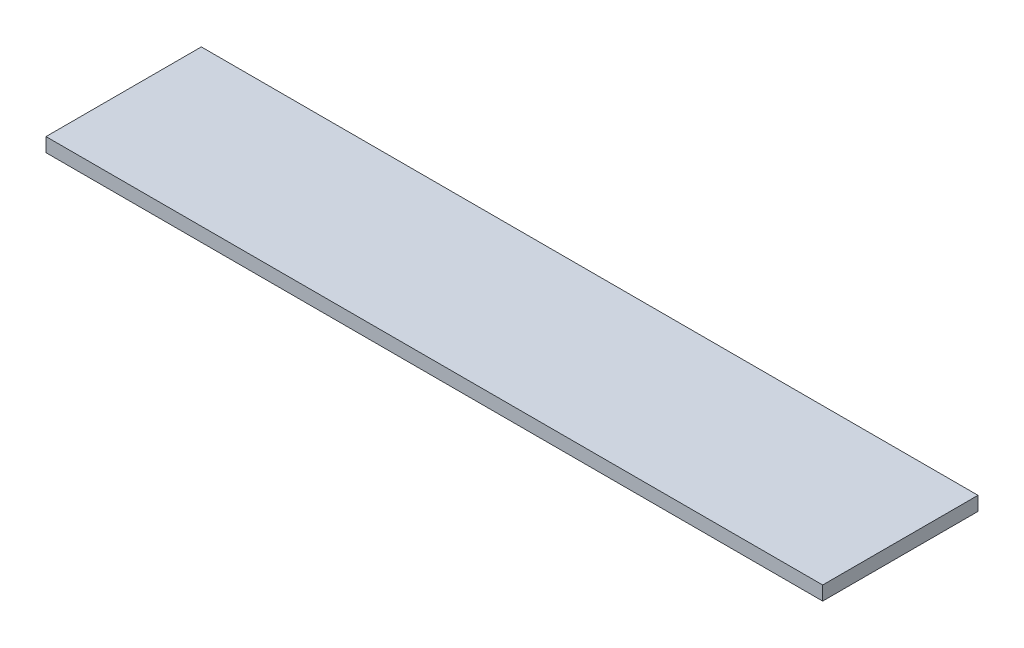
ISO-10303-21;
HEADER;
FILE_DESCRIPTION(('STEP AP214'),'2;1');
FILE_NAME('part.step','',(''),(''),'','','');
FILE_SCHEMA(('AUTOMOTIVE_DESIGN { 1 0 10303 214 1 1 1 1 }'));
ENDSEC;
DATA;
#1=APPLICATION_CONTEXT('core data for automotive mechanical design processes');
#2=APPLICATION_PROTOCOL_DEFINITION('international standard','automotive_design',2000,#1);
#3=PRODUCT_CONTEXT('',#1,'mechanical');
#4=PRODUCT('Part','Part','',(#3));
#5=PRODUCT_RELATED_PRODUCT_CATEGORY('part','',(#4));
#6=PRODUCT_DEFINITION_FORMATION('','',#4);
#7=PRODUCT_DEFINITION_CONTEXT('part definition',#1,'design');
#8=PRODUCT_DEFINITION('design','',#6,#7);
#9=PRODUCT_DEFINITION_SHAPE('','',#8);
#10=(LENGTH_UNIT() NAMED_UNIT(*) SI_UNIT(.MILLI.,.METRE.));
#11=(NAMED_UNIT(*) PLANE_ANGLE_UNIT() SI_UNIT($,.RADIAN.));
#12=(NAMED_UNIT(*) SI_UNIT($,.STERADIAN.) SOLID_ANGLE_UNIT());
#13=UNCERTAINTY_MEASURE_WITH_UNIT(LENGTH_MEASURE(1.E-05),#10,'distance_accuracy_value','');
#14=(GEOMETRIC_REPRESENTATION_CONTEXT(3) GLOBAL_UNCERTAINTY_ASSIGNED_CONTEXT((#13)) GLOBAL_UNIT_ASSIGNED_CONTEXT((#10,
#11,#12)) REPRESENTATION_CONTEXT('',''));
#15=CARTESIAN_POINT('',(0.,0.,0.));
#16=DIRECTION('',(0.,0.,1.));
#17=DIRECTION('',(1.,0.,0.));
#18=AXIS2_PLACEMENT_3D('',#15,#16,#17);
#19=CARTESIAN_POINT('',(500.,18.,-100.));
#20=DIRECTION('',(-1.,0.,0.));
#21=DIRECTION('',(0.,0.,1.));
#22=AXIS2_PLACEMENT_3D('',#19,#20,#21);
#23=PLANE('',#22);
#24=DIRECTION('',(0.,0.,-1.));
#25=VECTOR('',#24,1.);
#26=CARTESIAN_POINT('',(500.,0.,-100.));
#27=LINE('',#26,#25);
#28=CARTESIAN_POINT('',(500.,0.,100.));
#29=VERTEX_POINT('',#28);
#30=CARTESIAN_POINT('',(500.,0.,-100.));
#31=VERTEX_POINT('',#30);
#32=EDGE_CURVE('E96',#29,#31,#27,.T.);
#33=ORIENTED_EDGE('',*,*,#32,.T.);
#34=DIRECTION('',(0.,-1.,0.));
#35=VECTOR('',#34,1.);
#36=CARTESIAN_POINT('',(500.,18.,-100.));
#37=LINE('',#36,#35);
#38=CARTESIAN_POINT('',(500.,18.,-100.));
#39=VERTEX_POINT('',#38);
#40=EDGE_CURVE('E11',#39,#31,#37,.T.);
#41=ORIENTED_EDGE('',*,*,#40,.F.);
#42=DIRECTION('',(0.,0.,-1.));
#43=VECTOR('',#42,1.);
#44=CARTESIAN_POINT('',(500.,18.,-100.));
#45=LINE('',#44,#43);
#46=CARTESIAN_POINT('',(500.,18.,100.));
#47=VERTEX_POINT('',#46);
#48=EDGE_CURVE('E84',#47,#39,#45,.T.);
#49=ORIENTED_EDGE('',*,*,#48,.F.);
#50=DIRECTION('',(0.,-1.,0.));
#51=VECTOR('',#50,1.);
#52=CARTESIAN_POINT('',(500.,18.,100.));
#53=LINE('',#52,#51);
#54=EDGE_CURVE('E92',#47,#29,#53,.T.);
#55=ORIENTED_EDGE('',*,*,#54,.T.);
#56=EDGE_LOOP('',(#33,#41,#49,#55));
#57=FACE_BOUND('',#56,.T.);
#58=ADVANCED_FACE('F33',(#57),#23,.F.);
#59=CARTESIAN_POINT('',(-500.,18.,-100.));
#60=DIRECTION('',(0.,0.,1.));
#61=DIRECTION('',(1.,0.,0.));
#62=AXIS2_PLACEMENT_3D('',#59,#60,#61);
#63=PLANE('',#62);
#64=DIRECTION('',(-1.,0.,0.));
#65=VECTOR('',#64,1.);
#66=CARTESIAN_POINT('',(-500.,0.,-100.));
#67=LINE('',#66,#65);
#68=CARTESIAN_POINT('',(-500.,0.,-100.));
#69=VERTEX_POINT('',#68);
#70=EDGE_CURVE('E88',#31,#69,#67,.T.);
#71=ORIENTED_EDGE('',*,*,#70,.T.);
#72=DIRECTION('',(0.,-1.,0.));
#73=VECTOR('',#72,1.);
#74=CARTESIAN_POINT('',(-500.,18.,-100.));
#75=LINE('',#74,#73);
#76=CARTESIAN_POINT('',(-500.,18.,-100.));
#77=VERTEX_POINT('',#76);
#78=EDGE_CURVE('E41',#77,#69,#75,.T.);
#79=ORIENTED_EDGE('',*,*,#78,.F.);
#80=DIRECTION('',(-1.,0.,0.));
#81=VECTOR('',#80,1.);
#82=CARTESIAN_POINT('',(-500.,18.,-100.));
#83=LINE('',#82,#81);
#84=EDGE_CURVE('E79',#39,#77,#83,.T.);
#85=ORIENTED_EDGE('',*,*,#84,.F.);
#86=ORIENTED_EDGE('',*,*,#40,.T.);
#87=EDGE_LOOP('',(#71,#79,#85,#86));
#88=FACE_BOUND('',#87,.T.);
#89=ADVANCED_FACE('F87',(#88),#63,.F.);
#90=CARTESIAN_POINT('',(-500.,18.,-100.));
#91=DIRECTION('',(1.,0.,0.));
#92=DIRECTION('',(0.,0.,-1.));
#93=AXIS2_PLACEMENT_3D('',#90,#91,#92);
#94=PLANE('',#93);
#95=DIRECTION('',(0.,0.,1.));
#96=VECTOR('',#95,1.);
#97=CARTESIAN_POINT('',(-500.,0.,-100.));
#98=LINE('',#97,#96);
#99=CARTESIAN_POINT('',(-500.,0.,100.));
#100=VERTEX_POINT('',#99);
#101=EDGE_CURVE('E66',#69,#100,#98,.T.);
#102=ORIENTED_EDGE('',*,*,#101,.T.);
#103=DIRECTION('',(0.,-1.,0.));
#104=VECTOR('',#103,1.);
#105=CARTESIAN_POINT('',(-500.,18.,100.));
#106=LINE('',#105,#104);
#107=CARTESIAN_POINT('',(-500.,18.,100.));
#108=VERTEX_POINT('',#107);
#109=EDGE_CURVE('E89',#108,#100,#106,.T.);
#110=ORIENTED_EDGE('',*,*,#109,.F.);
#111=DIRECTION('',(0.,0.,1.));
#112=VECTOR('',#111,1.);
#113=CARTESIAN_POINT('',(-500.,18.,-100.));
#114=LINE('',#113,#112);
#115=EDGE_CURVE('E82',#77,#108,#114,.T.);
#116=ORIENTED_EDGE('',*,*,#115,.F.);
#117=ORIENTED_EDGE('',*,*,#78,.T.);
#118=EDGE_LOOP('',(#102,#110,#116,#117));
#119=FACE_BOUND('',#118,.T.);
#120=ADVANCED_FACE('F90',(#119),#94,.F.);
#121=CARTESIAN_POINT('',(-500.,18.,100.));
#122=DIRECTION('',(0.,0.,-1.));
#123=DIRECTION('',(-1.,0.,0.));
#124=AXIS2_PLACEMENT_3D('',#121,#122,#123);
#125=PLANE('',#124);
#126=DIRECTION('',(1.,0.,0.));
#127=VECTOR('',#126,1.);
#128=CARTESIAN_POINT('',(-500.,0.,100.));
#129=LINE('',#128,#127);
#130=EDGE_CURVE('E72',#100,#29,#129,.T.);
#131=ORIENTED_EDGE('',*,*,#130,.T.);
#132=ORIENTED_EDGE('',*,*,#54,.F.);
#133=DIRECTION('',(1.,0.,0.));
#134=VECTOR('',#133,1.);
#135=CARTESIAN_POINT('',(-500.,18.,100.));
#136=LINE('',#135,#134);
#137=EDGE_CURVE('E49',#108,#47,#136,.T.);
#138=ORIENTED_EDGE('',*,*,#137,.F.);
#139=ORIENTED_EDGE('',*,*,#109,.T.);
#140=EDGE_LOOP('',(#131,#132,#138,#139));
#141=FACE_BOUND('',#140,.T.);
#142=ADVANCED_FACE('F103',(#141),#125,.F.);
#143=CARTESIAN_POINT('',(0.,18.,0.));
#144=DIRECTION('',(0.,1.,0.));
#145=DIRECTION('',(0.,0.,1.));
#146=AXIS2_PLACEMENT_3D('',#143,#144,#145);
#147=PLANE('',#146);
#148=ORIENTED_EDGE('',*,*,#48,.T.);
#149=ORIENTED_EDGE('',*,*,#84,.T.);
#150=ORIENTED_EDGE('',*,*,#115,.T.);
#151=ORIENTED_EDGE('',*,*,#137,.T.);
#152=EDGE_LOOP('',(#148,#149,#150,#151));
#153=FACE_BOUND('',#152,.T.);
#154=ADVANCED_FACE('F80',(#153),#147,.T.);
#155=CARTESIAN_POINT('',(0.,0.,0.));
#156=DIRECTION('',(0.,1.,0.));
#157=DIRECTION('',(0.,0.,1.));
#158=AXIS2_PLACEMENT_3D('',#155,#156,#157);
#159=PLANE('',#158);
#160=ORIENTED_EDGE('',*,*,#32,.F.);
#161=ORIENTED_EDGE('',*,*,#130,.F.);
#162=ORIENTED_EDGE('',*,*,#101,.F.);
#163=ORIENTED_EDGE('',*,*,#70,.F.);
#164=EDGE_LOOP('',(#160,#161,#162,#163));
#165=FACE_BOUND('',#164,.T.);
#166=ADVANCED_FACE('F106',(#165),#159,.F.);
#167=CLOSED_SHELL('',(#58,#89,#120,#142,#154,#166));
#168=MANIFOLD_SOLID_BREP('B2',#167);
#169=ADVANCED_BREP_SHAPE_REPRESENTATION('',(#18,#168),#14);
#170=SHAPE_DEFINITION_REPRESENTATION(#9,#169);
ENDSEC;
END-ISO-10303-21;
